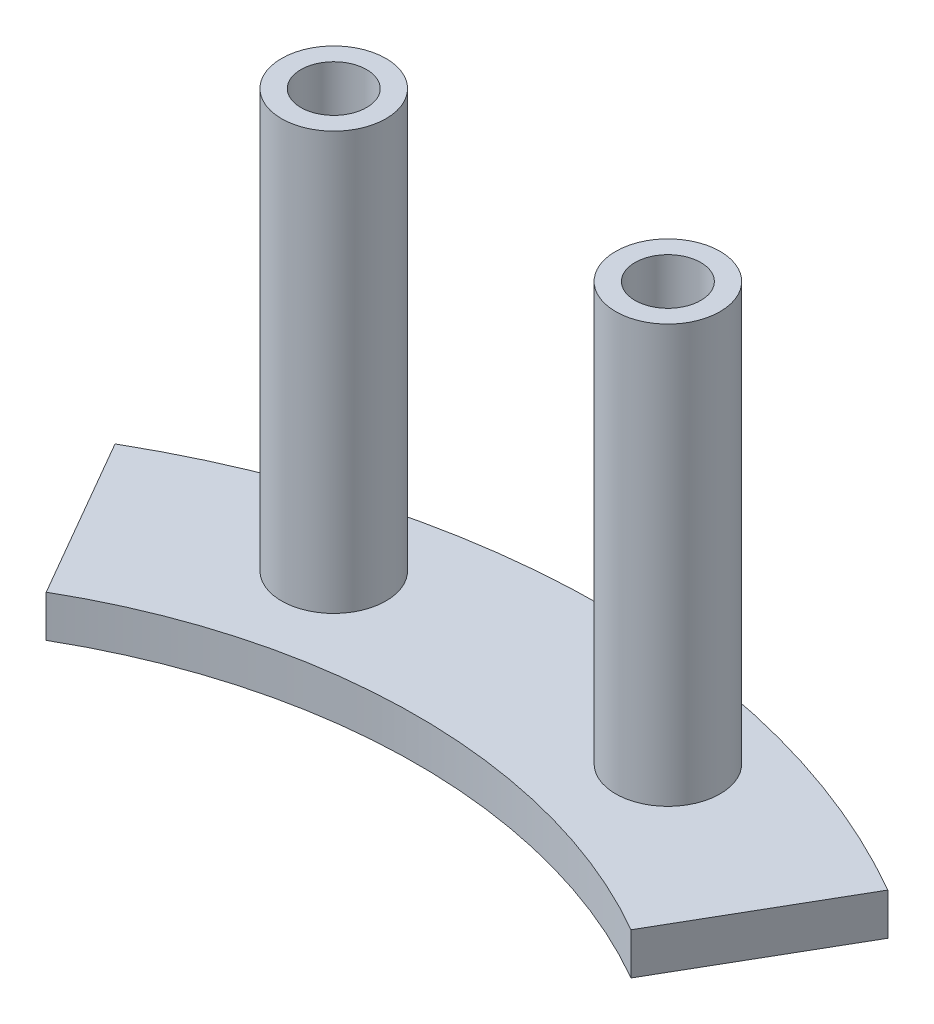
ISO-10303-21;
HEADER;
FILE_DESCRIPTION(('STEP AP214'),'2;1');
FILE_NAME('part.step','',(''),(''),'','','');
FILE_SCHEMA(('AUTOMOTIVE_DESIGN { 1 0 10303 214 1 1 1 1 }'));
ENDSEC;
DATA;
#1=APPLICATION_CONTEXT('core data for automotive mechanical design processes');
#2=APPLICATION_PROTOCOL_DEFINITION('international standard','automotive_design',2000,#1);
#3=PRODUCT_CONTEXT('',#1,'mechanical');
#4=PRODUCT('Part','Part','',(#3));
#5=PRODUCT_RELATED_PRODUCT_CATEGORY('part','',(#4));
#6=PRODUCT_DEFINITION_FORMATION('','',#4);
#7=PRODUCT_DEFINITION_CONTEXT('part definition',#1,'design');
#8=PRODUCT_DEFINITION('design','',#6,#7);
#9=PRODUCT_DEFINITION_SHAPE('','',#8);
#10=(LENGTH_UNIT() NAMED_UNIT(*) SI_UNIT(.MILLI.,.METRE.));
#11=(NAMED_UNIT(*) PLANE_ANGLE_UNIT() SI_UNIT($,.RADIAN.));
#12=(NAMED_UNIT(*) SI_UNIT($,.STERADIAN.) SOLID_ANGLE_UNIT());
#13=UNCERTAINTY_MEASURE_WITH_UNIT(LENGTH_MEASURE(1.E-05),#10,'distance_accuracy_value','');
#14=(GEOMETRIC_REPRESENTATION_CONTEXT(3) GLOBAL_UNCERTAINTY_ASSIGNED_CONTEXT((#13)) GLOBAL_UNIT_ASSIGNED_CONTEXT((#10,
#11,#12)) REPRESENTATION_CONTEXT('',''));
#15=CARTESIAN_POINT('',(0.,0.,0.));
#16=DIRECTION('',(0.,0.,1.));
#17=DIRECTION('',(1.,0.,0.));
#18=AXIS2_PLACEMENT_3D('',#15,#16,#17);
#19=CARTESIAN_POINT('',(0.,2.,0.));
#20=DIRECTION('',(0.,-1.,0.));
#21=DIRECTION('',(0.,0.,-1.));
#22=AXIS2_PLACEMENT_3D('',#19,#20,#21);
#23=CYLINDRICAL_SURFACE('',#22,37.);
#24=CARTESIAN_POINT('',(0.,0.,0.));
#25=DIRECTION('',(0.,1.,0.));
#26=DIRECTION('',(0.,0.,-1.));
#27=AXIS2_PLACEMENT_3D('',#24,#25,#26);
#28=CIRCLE('',#27,37.);
#29=CARTESIAN_POINT('',(18.4999999999999,0.,-32.0429399400243));
#30=VERTEX_POINT('',#29);
#31=CARTESIAN_POINT('',(-18.5000000000001,0.,-32.0429399400241));
#32=VERTEX_POINT('',#31);
#33=EDGE_CURVE('E108',#30,#32,#28,.T.);
#34=ORIENTED_EDGE('',*,*,#33,.T.);
#35=DIRECTION('',(0.,-1.,0.));
#36=VECTOR('',#35,1.);
#37=CARTESIAN_POINT('',(-18.5000000000001,2.,-32.0429399400241));
#38=LINE('',#37,#36);
#39=CARTESIAN_POINT('',(-18.5000000000001,2.,-32.0429399400241));
#40=VERTEX_POINT('',#39);
#41=EDGE_CURVE('E99',#40,#32,#38,.T.);
#42=ORIENTED_EDGE('',*,*,#41,.F.);
#43=CARTESIAN_POINT('',(0.,2.,0.));
#44=DIRECTION('',(0.,1.,0.));
#45=DIRECTION('',(0.,0.,-1.));
#46=AXIS2_PLACEMENT_3D('',#43,#44,#45);
#47=CIRCLE('',#46,37.);
#48=CARTESIAN_POINT('',(18.4999999999999,2.,-32.0429399400243));
#49=VERTEX_POINT('',#48);
#50=EDGE_CURVE('E93',#49,#40,#47,.T.);
#51=ORIENTED_EDGE('',*,*,#50,.F.);
#52=DIRECTION('',(0.,-1.,0.));
#53=VECTOR('',#52,1.);
#54=CARTESIAN_POINT('',(18.4999999999999,2.,-32.0429399400243));
#55=LINE('',#54,#53);
#56=EDGE_CURVE('E104',#49,#30,#55,.T.);
#57=ORIENTED_EDGE('',*,*,#56,.T.);
#58=EDGE_LOOP('',(#34,#42,#51,#57));
#59=FACE_BOUND('',#58,.T.);
#60=ADVANCED_FACE('F41',(#59),#23,.T.);
#61=CARTESIAN_POINT('',(-18.5000000000001,2.,-32.0429399400241));
#62=DIRECTION('',(0.866025403784436,0.,-0.500000000000004));
#63=DIRECTION('',(-0.500000000000004,0.,-0.866025403784436));
#64=AXIS2_PLACEMENT_3D('',#61,#62,#63);
#65=PLANE('',#64);
#66=DIRECTION('',(0.500000000000004,0.,0.866025403784436));
#67=VECTOR('',#66,1.);
#68=CARTESIAN_POINT('',(-18.5000000000001,0.,-32.0429399400241));
#69=LINE('',#68,#67);
#70=CARTESIAN_POINT('',(-14.0000000000001,0.,-24.2487113059642));
#71=VERTEX_POINT('',#70);
#72=EDGE_CURVE('E98',#32,#71,#69,.T.);
#73=ORIENTED_EDGE('',*,*,#72,.T.);
#74=DIRECTION('',(0.,-1.,0.));
#75=VECTOR('',#74,1.);
#76=CARTESIAN_POINT('',(-14.0000000000001,2.,-24.2487113059642));
#77=LINE('',#76,#75);
#78=CARTESIAN_POINT('',(-14.0000000000001,2.,-24.2487113059642));
#79=VERTEX_POINT('',#78);
#80=EDGE_CURVE('E96',#79,#71,#77,.T.);
#81=ORIENTED_EDGE('',*,*,#80,.F.);
#82=DIRECTION('',(0.500000000000004,0.,0.866025403784436));
#83=VECTOR('',#82,1.);
#84=CARTESIAN_POINT('',(-18.5000000000001,2.,-32.0429399400241));
#85=LINE('',#84,#83);
#86=EDGE_CURVE('E88',#40,#79,#85,.T.);
#87=ORIENTED_EDGE('',*,*,#86,.F.);
#88=ORIENTED_EDGE('',*,*,#41,.T.);
#89=EDGE_LOOP('',(#73,#81,#87,#88));
#90=FACE_BOUND('',#89,.T.);
#91=ADVANCED_FACE('F97',(#90),#65,.F.);
#92=CARTESIAN_POINT('',(0.,2.,0.));
#93=DIRECTION('',(0.,-1.,0.));
#94=DIRECTION('',(0.,0.,-1.));
#95=AXIS2_PLACEMENT_3D('',#92,#93,#94);
#96=CYLINDRICAL_SURFACE('',#95,28.);
#97=CARTESIAN_POINT('',(0.,0.,0.));
#98=DIRECTION('',(0.,-1.,0.));
#99=DIRECTION('',(0.,0.,-1.));
#100=AXIS2_PLACEMENT_3D('',#97,#98,#99);
#101=CIRCLE('',#100,28.);
#102=CARTESIAN_POINT('',(13.9999999999999,0.,-24.2487113059643));
#103=VERTEX_POINT('',#102);
#104=EDGE_CURVE('E74',#71,#103,#101,.T.);
#105=ORIENTED_EDGE('',*,*,#104,.T.);
#106=DIRECTION('',(0.,-1.,0.));
#107=VECTOR('',#106,1.);
#108=CARTESIAN_POINT('',(13.9999999999999,2.,-24.2487113059643));
#109=LINE('',#108,#107);
#110=CARTESIAN_POINT('',(13.9999999999999,2.,-24.2487113059643));
#111=VERTEX_POINT('',#110);
#112=EDGE_CURVE('E100',#111,#103,#109,.T.);
#113=ORIENTED_EDGE('',*,*,#112,.F.);
#114=CARTESIAN_POINT('',(0.,2.,0.));
#115=DIRECTION('',(0.,-1.,0.));
#116=DIRECTION('',(0.,0.,-1.));
#117=AXIS2_PLACEMENT_3D('',#114,#115,#116);
#118=CIRCLE('',#117,28.);
#119=EDGE_CURVE('E91',#79,#111,#118,.T.);
#120=ORIENTED_EDGE('',*,*,#119,.F.);
#121=ORIENTED_EDGE('',*,*,#80,.T.);
#122=EDGE_LOOP('',(#105,#113,#120,#121));
#123=FACE_BOUND('',#122,.T.);
#124=ADVANCED_FACE('F102',(#123),#96,.F.);
#125=CARTESIAN_POINT('',(18.4999999999999,2.,-32.0429399400243));
#126=DIRECTION('',(-0.86602540378444,0.,-0.499999999999998));
#127=DIRECTION('',(-0.499999999999998,0.,0.86602540378444));
#128=AXIS2_PLACEMENT_3D('',#125,#126,#127);
#129=PLANE('',#128);
#130=DIRECTION('',(0.499999999999998,0.,-0.86602540378444));
#131=VECTOR('',#130,1.);
#132=CARTESIAN_POINT('',(18.4999999999999,0.,-32.0429399400243));
#133=LINE('',#132,#131);
#134=EDGE_CURVE('E80',#103,#30,#133,.T.);
#135=ORIENTED_EDGE('',*,*,#134,.T.);
#136=ORIENTED_EDGE('',*,*,#56,.F.);
#137=DIRECTION('',(0.499999999999998,0.,-0.86602540378444));
#138=VECTOR('',#137,1.);
#139=CARTESIAN_POINT('',(18.4999999999999,2.,-32.0429399400243));
#140=LINE('',#139,#138);
#141=EDGE_CURVE('E57',#111,#49,#140,.T.);
#142=ORIENTED_EDGE('',*,*,#141,.F.);
#143=ORIENTED_EDGE('',*,*,#112,.T.);
#144=EDGE_LOOP('',(#135,#136,#142,#143));
#145=FACE_BOUND('',#144,.T.);
#146=ADVANCED_FACE('F124',(#145),#129,.F.);
#147=CARTESIAN_POINT('',(0.,2.,0.));
#148=DIRECTION('',(0.,-1.,0.));
#149=DIRECTION('',(0.,0.,-1.));
#150=AXIS2_PLACEMENT_3D('',#147,#148,#149);
#151=PLANE('',#150);
#152=CARTESIAN_POINT('',(8.,2.,-32.0156211871643));
#153=DIRECTION('',(0.,-1.,0.));
#154=DIRECTION('',(0.,0.,-1.));
#155=AXIS2_PLACEMENT_3D('',#152,#153,#154);
#156=CIRCLE('',#155,2.5);
#157=CARTESIAN_POINT('',(8.,2.,-34.5156211871643));
#158=VERTEX_POINT('',#157);
#159=EDGE_CURVE('E11',#158,#158,#156,.F.);
#160=ORIENTED_EDGE('',*,*,#159,.F.);
#161=EDGE_LOOP('',(#160));
#162=FACE_BOUND('',#161,.T.);
#163=CARTESIAN_POINT('',(-8.,2.,-32.0156211871643));
#164=DIRECTION('',(0.,-1.,0.));
#165=DIRECTION('',(0.,0.,-1.));
#166=AXIS2_PLACEMENT_3D('',#163,#164,#165);
#167=CIRCLE('',#166,2.5);
#168=CARTESIAN_POINT('',(-8.,2.,-34.5156211871643));
#169=VERTEX_POINT('',#168);
#170=EDGE_CURVE('E49',#169,#169,#167,.F.);
#171=ORIENTED_EDGE('',*,*,#170,.F.);
#172=EDGE_LOOP('',(#171));
#173=FACE_BOUND('',#172,.T.);
#174=ORIENTED_EDGE('',*,*,#50,.T.);
#175=ORIENTED_EDGE('',*,*,#86,.T.);
#176=ORIENTED_EDGE('',*,*,#119,.T.);
#177=ORIENTED_EDGE('',*,*,#141,.T.);
#178=EDGE_LOOP('',(#174,#175,#176,#177));
#179=FACE_BOUND('',#178,.T.);
#180=ADVANCED_FACE('F89',(#162,#173,#179),#151,.F.);
#181=CARTESIAN_POINT('',(0.,0.,0.));
#182=DIRECTION('',(0.,-1.,0.));
#183=DIRECTION('',(0.,0.,-1.));
#184=AXIS2_PLACEMENT_3D('',#181,#182,#183);
#185=PLANE('',#184);
#186=ORIENTED_EDGE('',*,*,#33,.F.);
#187=ORIENTED_EDGE('',*,*,#134,.F.);
#188=ORIENTED_EDGE('',*,*,#104,.F.);
#189=ORIENTED_EDGE('',*,*,#72,.F.);
#190=EDGE_LOOP('',(#186,#187,#188,#189));
#191=FACE_BOUND('',#190,.T.);
#192=ADVANCED_FACE('F123',(#191),#185,.T.);
#193=CARTESIAN_POINT('',(-8.,22.,-32.0156211871643));
#194=DIRECTION('',(0.,-1.,0.));
#195=DIRECTION('',(0.,0.,-1.));
#196=AXIS2_PLACEMENT_3D('',#193,#194,#195);
#197=CYLINDRICAL_SURFACE('',#196,2.5);
#198=CARTESIAN_POINT('',(-8.,22.,-32.0156211871643));
#199=DIRECTION('',(0.,1.,0.));
#200=DIRECTION('',(0.,0.,1.));
#201=AXIS2_PLACEMENT_3D('',#198,#199,#200);
#202=CIRCLE('',#201,2.5);
#203=CARTESIAN_POINT('',(-8.,22.,-29.5156211871643));
#204=VERTEX_POINT('',#203);
#205=EDGE_CURVE('E111',#204,#204,#202,.T.);
#206=ORIENTED_EDGE('',*,*,#205,.F.);
#207=EDGE_LOOP('',(#206));
#208=FACE_BOUND('',#207,.T.);
#209=ORIENTED_EDGE('',*,*,#170,.T.);
#210=EDGE_LOOP('',(#209));
#211=FACE_BOUND('',#210,.T.);
#212=ADVANCED_FACE('F120',(#208,#211),#197,.T.);
#213=CARTESIAN_POINT('',(-8.,22.,-32.0156211871643));
#214=DIRECTION('',(0.,1.,0.));
#215=DIRECTION('',(0.,0.,1.));
#216=AXIS2_PLACEMENT_3D('',#213,#214,#215);
#217=PLANE('',#216);
#218=CARTESIAN_POINT('',(-8.,22.,-32.0156211871643));
#219=DIRECTION('',(0.,1.,0.));
#220=DIRECTION('',(0.,0.,1.));
#221=AXIS2_PLACEMENT_3D('',#218,#219,#220);
#222=CIRCLE('',#221,1.575);
#223=CARTESIAN_POINT('',(-8.,22.,-30.4406211871643));
#224=VERTEX_POINT('',#223);
#225=EDGE_CURVE('E156',#224,#224,#222,.T.);
#226=ORIENTED_EDGE('',*,*,#225,.F.);
#227=EDGE_LOOP('',(#226));
#228=FACE_BOUND('',#227,.T.);
#229=ORIENTED_EDGE('',*,*,#205,.T.);
#230=EDGE_LOOP('',(#229));
#231=FACE_BOUND('',#230,.T.);
#232=ADVANCED_FACE('F171',(#228,#231),#217,.T.);
#233=CARTESIAN_POINT('',(8.,22.,-32.0156211871643));
#234=DIRECTION('',(0.,-1.,0.));
#235=DIRECTION('',(0.,0.,-1.));
#236=AXIS2_PLACEMENT_3D('',#233,#234,#235);
#237=CYLINDRICAL_SURFACE('',#236,2.5);
#238=CARTESIAN_POINT('',(8.,22.,-32.0156211871643));
#239=DIRECTION('',(0.,1.,0.));
#240=DIRECTION('',(0.,0.,1.));
#241=AXIS2_PLACEMENT_3D('',#238,#239,#240);
#242=CIRCLE('',#241,2.5);
#243=CARTESIAN_POINT('',(8.,22.,-29.5156211871643));
#244=VERTEX_POINT('',#243);
#245=EDGE_CURVE('E146',#244,#244,#242,.T.);
#246=ORIENTED_EDGE('',*,*,#245,.F.);
#247=EDGE_LOOP('',(#246));
#248=FACE_BOUND('',#247,.T.);
#249=ORIENTED_EDGE('',*,*,#159,.T.);
#250=EDGE_LOOP('',(#249));
#251=FACE_BOUND('',#250,.T.);
#252=ADVANCED_FACE('F174',(#248,#251),#237,.T.);
#253=CARTESIAN_POINT('',(8.,22.,-32.0156211871643));
#254=DIRECTION('',(0.,1.,0.));
#255=DIRECTION('',(0.,0.,1.));
#256=AXIS2_PLACEMENT_3D('',#253,#254,#255);
#257=PLANE('',#256);
#258=CARTESIAN_POINT('',(8.,22.,-32.0156211871643));
#259=DIRECTION('',(0.,1.,0.));
#260=DIRECTION('',(0.,0.,1.));
#261=AXIS2_PLACEMENT_3D('',#258,#259,#260);
#262=CIRCLE('',#261,1.575);
#263=CARTESIAN_POINT('',(8.,22.,-30.4406211871643));
#264=VERTEX_POINT('',#263);
#265=EDGE_CURVE('E150',#264,#264,#262,.T.);
#266=ORIENTED_EDGE('',*,*,#265,.F.);
#267=EDGE_LOOP('',(#266));
#268=FACE_BOUND('',#267,.T.);
#269=ORIENTED_EDGE('',*,*,#245,.T.);
#270=EDGE_LOOP('',(#269));
#271=FACE_BOUND('',#270,.T.);
#272=ADVANCED_FACE('F183',(#268,#271),#257,.T.);
#273=CARTESIAN_POINT('',(8.,18.5,-32.0156211871643));
#274=DIRECTION('',(0.,1.,0.));
#275=DIRECTION('',(0.,0.,1.));
#276=AXIS2_PLACEMENT_3D('',#273,#274,#275);
#277=CYLINDRICAL_SURFACE('',#276,1.575);
#278=CARTESIAN_POINT('',(8.,18.5,-32.0156211871643));
#279=DIRECTION('',(0.,1.,0.));
#280=DIRECTION('',(0.,0.,1.));
#281=AXIS2_PLACEMENT_3D('',#278,#279,#280);
#282=CIRCLE('',#281,1.575);
#283=CARTESIAN_POINT('',(8.,18.5,-30.4406211871643));
#284=VERTEX_POINT('',#283);
#285=EDGE_CURVE('E153',#284,#284,#282,.T.);
#286=ORIENTED_EDGE('',*,*,#285,.F.);
#287=EDGE_LOOP('',(#286));
#288=FACE_BOUND('',#287,.T.);
#289=ORIENTED_EDGE('',*,*,#265,.T.);
#290=EDGE_LOOP('',(#289));
#291=FACE_BOUND('',#290,.T.);
#292=ADVANCED_FACE('F187',(#288,#291),#277,.F.);
#293=CARTESIAN_POINT('',(8.,18.5,-32.0156211871643));
#294=DIRECTION('',(0.,1.,0.));
#295=DIRECTION('',(0.,0.,1.));
#296=AXIS2_PLACEMENT_3D('',#293,#294,#295);
#297=PLANE('',#296);
#298=ORIENTED_EDGE('',*,*,#285,.T.);
#299=EDGE_LOOP('',(#298));
#300=FACE_BOUND('',#299,.T.);
#301=ADVANCED_FACE('F167',(#300),#297,.T.);
#302=CARTESIAN_POINT('',(-8.,18.5,-32.0156211871643));
#303=DIRECTION('',(0.,1.,0.));
#304=DIRECTION('',(0.,0.,1.));
#305=AXIS2_PLACEMENT_3D('',#302,#303,#304);
#306=CYLINDRICAL_SURFACE('',#305,1.575);
#307=CARTESIAN_POINT('',(-8.,18.5,-32.0156211871643));
#308=DIRECTION('',(0.,1.,0.));
#309=DIRECTION('',(0.,0.,1.));
#310=AXIS2_PLACEMENT_3D('',#307,#308,#309);
#311=CIRCLE('',#310,1.575);
#312=CARTESIAN_POINT('',(-8.,18.5,-30.4406211871643));
#313=VERTEX_POINT('',#312);
#314=EDGE_CURVE('E149',#313,#313,#311,.T.);
#315=ORIENTED_EDGE('',*,*,#314,.F.);
#316=EDGE_LOOP('',(#315));
#317=FACE_BOUND('',#316,.T.);
#318=ORIENTED_EDGE('',*,*,#225,.T.);
#319=EDGE_LOOP('',(#318));
#320=FACE_BOUND('',#319,.T.);
#321=ADVANCED_FACE('F164',(#317,#320),#306,.F.);
#322=CARTESIAN_POINT('',(-8.,18.5,-32.0156211871643));
#323=DIRECTION('',(0.,1.,0.));
#324=DIRECTION('',(0.,0.,1.));
#325=AXIS2_PLACEMENT_3D('',#322,#323,#324);
#326=PLANE('',#325);
#327=ORIENTED_EDGE('',*,*,#314,.T.);
#328=EDGE_LOOP('',(#327));
#329=FACE_BOUND('',#328,.T.);
#330=ADVANCED_FACE('F162',(#329),#326,.T.);
#331=CLOSED_SHELL('',(#60,#91,#124,#146,#180,#192,#212,#232,#252,#272,#292,#301,#321,#330));
#332=MANIFOLD_SOLID_BREP('B2',#331);
#333=ADVANCED_BREP_SHAPE_REPRESENTATION('',(#18,#332),#14);
#334=SHAPE_DEFINITION_REPRESENTATION(#9,#333);
ENDSEC;
END-ISO-10303-21;
